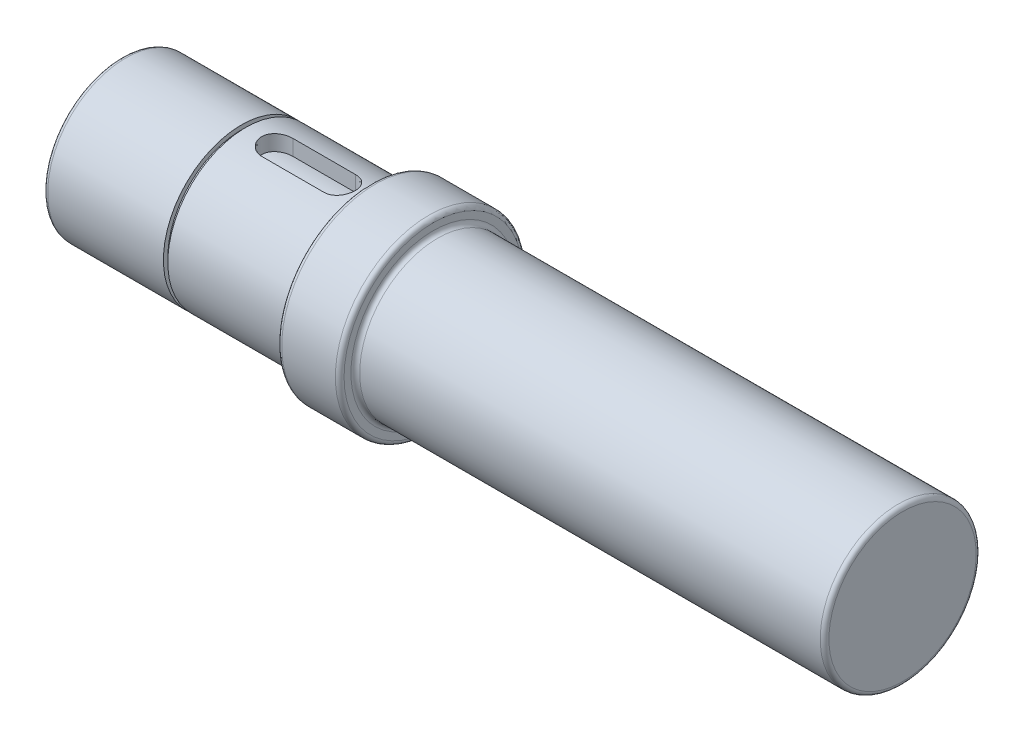
ISO-10303-21;
HEADER;
FILE_DESCRIPTION(('STEP AP214'),'2;1');
FILE_NAME('part.step','',(''),(''),'','','');
FILE_SCHEMA(('AUTOMOTIVE_DESIGN { 1 0 10303 214 1 1 1 1 }'));
ENDSEC;
DATA;
#1=APPLICATION_CONTEXT('core data for automotive mechanical design processes');
#2=APPLICATION_PROTOCOL_DEFINITION('international standard','automotive_design',2000,#1);
#3=PRODUCT_CONTEXT('',#1,'mechanical');
#4=PRODUCT('Part','Part','',(#3));
#5=PRODUCT_RELATED_PRODUCT_CATEGORY('part','',(#4));
#6=PRODUCT_DEFINITION_FORMATION('','',#4);
#7=PRODUCT_DEFINITION_CONTEXT('part definition',#1,'design');
#8=PRODUCT_DEFINITION('design','',#6,#7);
#9=PRODUCT_DEFINITION_SHAPE('','',#8);
#10=(LENGTH_UNIT() NAMED_UNIT(*) SI_UNIT(.MILLI.,.METRE.));
#11=(NAMED_UNIT(*) PLANE_ANGLE_UNIT() SI_UNIT($,.RADIAN.));
#12=(NAMED_UNIT(*) SI_UNIT($,.STERADIAN.) SOLID_ANGLE_UNIT());
#13=UNCERTAINTY_MEASURE_WITH_UNIT(LENGTH_MEASURE(1.E-05),#10,'distance_accuracy_value','');
#14=(GEOMETRIC_REPRESENTATION_CONTEXT(3) GLOBAL_UNCERTAINTY_ASSIGNED_CONTEXT((#13)) GLOBAL_UNIT_ASSIGNED_CONTEXT((#10,
#11,#12)) REPRESENTATION_CONTEXT('',''));
#15=CARTESIAN_POINT('',(0.,0.,0.));
#16=DIRECTION('',(0.,0.,1.));
#17=DIRECTION('',(1.,0.,0.));
#18=AXIS2_PLACEMENT_3D('',#15,#16,#17);
#19=CARTESIAN_POINT('',(318.008,0.,0.));
#20=DIRECTION('',(1.,0.,0.));
#21=DIRECTION('',(0.,0.,-1.));
#22=AXIS2_PLACEMENT_3D('',#19,#20,#21);
#23=CYLINDRICAL_SURFACE('',#22,31.75);
#24=CARTESIAN_POINT('',(50.673,0.,0.));
#25=DIRECTION('',(1.,0.,0.));
#26=DIRECTION('',(0.,0.,-1.));
#27=AXIS2_PLACEMENT_3D('',#24,#25,#26);
#28=CIRCLE('',#27,31.75);
#29=CARTESIAN_POINT('',(50.673,0.,-31.75));
#30=VERTEX_POINT('',#29);
#31=EDGE_CURVE('E188',#30,#30,#28,.T.);
#32=ORIENTED_EDGE('',*,*,#31,.T.);
#33=EDGE_LOOP('',(#32));
#34=FACE_BOUND('',#33,.T.);
#35=CARTESIAN_POINT('',(99.822,0.,0.));
#36=DIRECTION('',(1.,0.,0.));
#37=DIRECTION('',(0.,0.,-1.));
#38=AXIS2_PLACEMENT_3D('',#35,#36,#37);
#39=CIRCLE('',#38,31.75);
#40=CARTESIAN_POINT('',(99.822,0.,-31.75));
#41=VERTEX_POINT('',#40);
#42=EDGE_CURVE('E192',#41,#41,#39,.T.);
#43=ORIENTED_EDGE('',*,*,#42,.F.);
#44=EDGE_LOOP('',(#43));
#45=FACE_BOUND('',#44,.T.);
#46=CARTESIAN_POINT('',(88.9,31.1085197333464,6.35000000000002));
#47=CARTESIAN_POINT('',(89.7411838584888,31.1085197333463,6.35000000000002));
#48=CARTESIAN_POINT('',(90.5664285797414,31.143702637818,6.18365868766048));
#49=CARTESIAN_POINT('',(92.1031323767784,31.2636096253235,5.54567957546157));
#50=CARTESIAN_POINT('',(92.8061219084431,31.3474662779309,5.07414415278685));
#51=CARTESIAN_POINT('',(94.5582549968107,31.597773091446,3.32198124296136));
#52=CARTESIAN_POINT('',(95.2486500228985,31.749730004665,1.66607568080148));
#53=CARTESIAN_POINT('',(95.2513457951289,31.7502691589406,-1.65576927079387));
#54=CARTESIAN_POINT('',(94.5721209463598,31.599838788718,-3.30690169859765));
#55=CARTESIAN_POINT('',(92.2128218539865,31.2626237555181,-5.66866529599969));
#56=CARTESIAN_POINT('',(90.5823786748942,31.1085197333464,-6.34999999999999));
#57=CARTESIAN_POINT('',(88.9,31.1085197333464,-6.34999999999998));
#58=B_SPLINE_CURVE_WITH_KNOTS('',3,(#46,#47,#48,#49,#50,#51,#52,#53,#54,#55,#56,#57),
.UNSPECIFIED.,.F.,.F.,(4,2,2,2,2,4),(0.,0.125,0.25,0.5,0.75,1.),.UNSPECIFIED.);
#59=CARTESIAN_POINT('',(88.9,31.1085197333464,6.34999999999997));
#60=VERTEX_POINT('',#59);
#61=CARTESIAN_POINT('',(88.9,31.1085197333463,-6.35000000000008));
#62=VERTEX_POINT('',#61);
#63=EDGE_CURVE('E67',#60,#62,#58,.T.);
#64=ORIENTED_EDGE('',*,*,#63,.F.);
#65=DIRECTION('',(1.,0.,0.));
#66=VECTOR('',#65,1.);
#67=CARTESIAN_POINT('',(318.008,31.1085197333464,6.34999999999991));
#68=LINE('',#67,#66);
#69=CARTESIAN_POINT('',(63.5,31.1085197333464,6.34999999999998));
#70=VERTEX_POINT('',#69);
#71=EDGE_CURVE('E106',#70,#60,#68,.T.);
#72=ORIENTED_EDGE('',*,*,#71,.F.);
#73=CARTESIAN_POINT('',(63.5,31.1085197333464,-6.35));
#74=CARTESIAN_POINT('',(62.6588161415112,31.1085197333464,-6.35));
#75=CARTESIAN_POINT('',(61.8335714202586,31.143702637818,-6.18365868766046));
#76=CARTESIAN_POINT('',(60.2968676232216,31.2636096253235,-5.54567957546155));
#77=CARTESIAN_POINT('',(59.5938780915569,31.3474662779309,-5.07414415278683));
#78=CARTESIAN_POINT('',(57.8417450031893,31.597773091446,-3.32198124296134));
#79=CARTESIAN_POINT('',(57.1513499771015,31.749730004665,-1.66607568080146));
#80=CARTESIAN_POINT('',(57.1486542048711,31.7502691589406,1.65576927079387));
#81=CARTESIAN_POINT('',(57.8278790536402,31.599838788718,3.30690169859764));
#82=CARTESIAN_POINT('',(60.1871781460135,31.2626237555181,5.66866529599969));
#83=CARTESIAN_POINT('',(61.8176213251058,31.1085197333464,6.35));
#84=CARTESIAN_POINT('',(63.5,31.1085197333464,6.35));
#85=B_SPLINE_CURVE_WITH_KNOTS('',3,(#73,#74,#75,#76,#77,#78,#79,#80,#81,#82,#83,#84),
.UNSPECIFIED.,.F.,.F.,(4,2,2,2,2,4),(0.,0.125,0.25,0.5,0.75,1.),.UNSPECIFIED.);
#86=CARTESIAN_POINT('',(63.5,31.1085197333464,-6.35000000000004));
#87=VERTEX_POINT('',#86);
#88=EDGE_CURVE('E114',#87,#70,#85,.T.);
#89=ORIENTED_EDGE('',*,*,#88,.F.);
#90=DIRECTION('',(1.,0.,0.));
#91=VECTOR('',#90,1.);
#92=CARTESIAN_POINT('',(318.008,31.1085197333463,-6.35000000000009));
#93=LINE('',#92,#91);
#94=EDGE_CURVE('E172',#87,#62,#93,.T.);
#95=ORIENTED_EDGE('',*,*,#94,.T.);
#96=EDGE_LOOP('',(#64,#72,#89,#95));
#97=FACE_BOUND('',#96,.T.);
#98=ADVANCED_FACE('F47',(#34,#45,#97),#23,.T.);
#99=CARTESIAN_POINT('',(318.008,0.,0.));
#100=DIRECTION('',(-1.,0.,0.));
#101=DIRECTION('',(0.,0.,1.));
#102=AXIS2_PLACEMENT_3D('',#99,#100,#101);
#103=PLANE('',#102);
#104=CARTESIAN_POINT('',(318.008,0.,0.));
#105=DIRECTION('',(1.,0.,0.));
#106=DIRECTION('',(0.,0.,-1.));
#107=AXIS2_PLACEMENT_3D('',#104,#105,#106);
#108=CIRCLE('',#107,29.972);
#109=CARTESIAN_POINT('',(318.008,0.,-29.972));
#110=VERTEX_POINT('',#109);
#111=EDGE_CURVE('E11',#110,#110,#108,.T.);
#112=ORIENTED_EDGE('',*,*,#111,.T.);
#113=EDGE_LOOP('',(#112));
#114=FACE_BOUND('',#113,.T.);
#115=ADVANCED_FACE('F49',(#114),#103,.F.);
#116=CARTESIAN_POINT('',(316.23,0.,0.));
#117=DIRECTION('',(1.,0.,0.));
#118=DIRECTION('',(0.,0.,-1.));
#119=AXIS2_PLACEMENT_3D('',#116,#117,#118);
#120=TOROIDAL_SURFACE('',#119,29.972,1.778);
#121=CARTESIAN_POINT('',(316.23,0.,0.));
#122=DIRECTION('',(1.,0.,0.));
#123=DIRECTION('',(0.,0.,-1.));
#124=AXIS2_PLACEMENT_3D('',#121,#122,#123);
#125=CIRCLE('',#124,31.75);
#126=CARTESIAN_POINT('',(316.23,0.,-31.75));
#127=VERTEX_POINT('',#126);
#128=EDGE_CURVE('E59',#127,#127,#125,.T.);
#129=ORIENTED_EDGE('',*,*,#128,.T.);
#130=EDGE_LOOP('',(#129));
#131=FACE_BOUND('',#130,.T.);
#132=ORIENTED_EDGE('',*,*,#111,.F.);
#133=EDGE_LOOP('',(#132));
#134=FACE_BOUND('',#133,.T.);
#135=ADVANCED_FACE('F286',(#131,#134),#120,.T.);
#136=CARTESIAN_POINT('',(318.008,0.,0.));
#137=DIRECTION('',(1.,0.,0.));
#138=DIRECTION('',(0.,0.,-1.));
#139=AXIS2_PLACEMENT_3D('',#136,#137,#138);
#140=CYLINDRICAL_SURFACE('',#139,31.75);
#141=ORIENTED_EDGE('',*,*,#128,.F.);
#142=EDGE_LOOP('',(#141));
#143=FACE_BOUND('',#142,.T.);
#144=CARTESIAN_POINT('',(128.778,0.,0.));
#145=DIRECTION('',(1.,0.,0.));
#146=DIRECTION('',(0.,0.,-1.));
#147=AXIS2_PLACEMENT_3D('',#144,#145,#146);
#148=CIRCLE('',#147,31.75);
#149=CARTESIAN_POINT('',(128.778,0.,-31.75));
#150=VERTEX_POINT('',#149);
#151=EDGE_CURVE('E220',#150,#150,#148,.T.);
#152=ORIENTED_EDGE('',*,*,#151,.T.);
#153=EDGE_LOOP('',(#152));
#154=FACE_BOUND('',#153,.T.);
#155=ADVANCED_FACE('F283',(#143,#154),#140,.T.);
#156=CARTESIAN_POINT('',(128.778,0.,0.));
#157=DIRECTION('',(1.,0.,0.));
#158=DIRECTION('',(0.,0.,-1.));
#159=AXIS2_PLACEMENT_3D('',#156,#157,#158);
#160=TOROIDAL_SURFACE('',#159,33.528,1.778);
#161=ORIENTED_EDGE('',*,*,#151,.F.);
#162=EDGE_LOOP('',(#161));
#163=FACE_BOUND('',#162,.T.);
#164=CARTESIAN_POINT('',(127.,0.,0.));
#165=DIRECTION('',(1.,0.,0.));
#166=DIRECTION('',(0.,0.,-1.));
#167=AXIS2_PLACEMENT_3D('',#164,#165,#166);
#168=CIRCLE('',#167,33.528);
#169=CARTESIAN_POINT('',(127.,0.,-33.528));
#170=VERTEX_POINT('',#169);
#171=EDGE_CURVE('E216',#170,#170,#168,.T.);
#172=ORIENTED_EDGE('',*,*,#171,.T.);
#173=EDGE_LOOP('',(#172));
#174=FACE_BOUND('',#173,.T.);
#175=ADVANCED_FACE('F279',(#163,#174),#160,.F.);
#176=CARTESIAN_POINT('',(127.,0.,0.));
#177=DIRECTION('',(-1.,0.,0.));
#178=DIRECTION('',(0.,0.,1.));
#179=AXIS2_PLACEMENT_3D('',#176,#177,#178);
#180=PLANE('',#179);
#181=ORIENTED_EDGE('',*,*,#171,.F.);
#182=EDGE_LOOP('',(#181));
#183=FACE_BOUND('',#182,.T.);
#184=CARTESIAN_POINT('',(127.,0.,0.));
#185=DIRECTION('',(1.,0.,0.));
#186=DIRECTION('',(0.,0.,-1.));
#187=AXIS2_PLACEMENT_3D('',#184,#185,#186);
#188=CIRCLE('',#187,36.322);
#189=CARTESIAN_POINT('',(127.,0.,-36.322));
#190=VERTEX_POINT('',#189);
#191=EDGE_CURVE('E212',#190,#190,#188,.T.);
#192=ORIENTED_EDGE('',*,*,#191,.T.);
#193=EDGE_LOOP('',(#192));
#194=FACE_BOUND('',#193,.T.);
#195=ADVANCED_FACE('F275',(#183,#194),#180,.F.);
#196=CARTESIAN_POINT('',(125.222,0.,0.));
#197=DIRECTION('',(1.,0.,0.));
#198=DIRECTION('',(0.,0.,-1.));
#199=AXIS2_PLACEMENT_3D('',#196,#197,#198);
#200=TOROIDAL_SURFACE('',#199,36.322,1.778);
#201=CARTESIAN_POINT('',(125.222,0.,0.));
#202=DIRECTION('',(1.,0.,0.));
#203=DIRECTION('',(0.,0.,-1.));
#204=AXIS2_PLACEMENT_3D('',#201,#202,#203);
#205=CIRCLE('',#204,38.1);
#206=CARTESIAN_POINT('',(125.222,0.,-38.1));
#207=VERTEX_POINT('',#206);
#208=EDGE_CURVE('E208',#207,#207,#205,.T.);
#209=ORIENTED_EDGE('',*,*,#208,.T.);
#210=EDGE_LOOP('',(#209));
#211=FACE_BOUND('',#210,.T.);
#212=ORIENTED_EDGE('',*,*,#191,.F.);
#213=EDGE_LOOP('',(#212));
#214=FACE_BOUND('',#213,.T.);
#215=ADVANCED_FACE('F271',(#211,#214),#200,.T.);
#216=CARTESIAN_POINT('',(318.008,0.,0.));
#217=DIRECTION('',(1.,0.,0.));
#218=DIRECTION('',(0.,0.,-1.));
#219=AXIS2_PLACEMENT_3D('',#216,#217,#218);
#220=CYLINDRICAL_SURFACE('',#219,38.1);
#221=ORIENTED_EDGE('',*,*,#208,.F.);
#222=EDGE_LOOP('',(#221));
#223=FACE_BOUND('',#222,.T.);
#224=CARTESIAN_POINT('',(103.378,0.,0.));
#225=DIRECTION('',(1.,0.,0.));
#226=DIRECTION('',(0.,0.,-1.));
#227=AXIS2_PLACEMENT_3D('',#224,#225,#226);
#228=CIRCLE('',#227,38.1);
#229=CARTESIAN_POINT('',(103.378,0.,-38.1));
#230=VERTEX_POINT('',#229);
#231=EDGE_CURVE('E204',#230,#230,#228,.T.);
#232=ORIENTED_EDGE('',*,*,#231,.T.);
#233=EDGE_LOOP('',(#232));
#234=FACE_BOUND('',#233,.T.);
#235=ADVANCED_FACE('F267',(#223,#234),#220,.T.);
#236=CARTESIAN_POINT('',(103.378,0.,0.));
#237=DIRECTION('',(1.,0.,0.));
#238=DIRECTION('',(0.,0.,-1.));
#239=AXIS2_PLACEMENT_3D('',#236,#237,#238);
#240=TOROIDAL_SURFACE('',#239,36.322,1.778);
#241=CARTESIAN_POINT('',(101.6,0.,0.));
#242=DIRECTION('',(1.,0.,0.));
#243=DIRECTION('',(0.,0.,-1.));
#244=AXIS2_PLACEMENT_3D('',#241,#242,#243);
#245=CIRCLE('',#244,36.322);
#246=CARTESIAN_POINT('',(101.6,0.,-36.322));
#247=VERTEX_POINT('',#246);
#248=EDGE_CURVE('E200',#247,#247,#245,.T.);
#249=ORIENTED_EDGE('',*,*,#248,.T.);
#250=EDGE_LOOP('',(#249));
#251=FACE_BOUND('',#250,.T.);
#252=ORIENTED_EDGE('',*,*,#231,.F.);
#253=EDGE_LOOP('',(#252));
#254=FACE_BOUND('',#253,.T.);
#255=ADVANCED_FACE('F263',(#251,#254),#240,.T.);
#256=CARTESIAN_POINT('',(101.6,0.,0.));
#257=DIRECTION('',(1.,0.,0.));
#258=DIRECTION('',(0.,0.,-1.));
#259=AXIS2_PLACEMENT_3D('',#256,#257,#258);
#260=PLANE('',#259);
#261=ORIENTED_EDGE('',*,*,#248,.F.);
#262=EDGE_LOOP('',(#261));
#263=FACE_BOUND('',#262,.T.);
#264=CARTESIAN_POINT('',(101.6,0.,0.));
#265=DIRECTION('',(1.,0.,0.));
#266=DIRECTION('',(0.,0.,-1.));
#267=AXIS2_PLACEMENT_3D('',#264,#265,#266);
#268=CIRCLE('',#267,33.528);
#269=CARTESIAN_POINT('',(101.6,0.,-33.528));
#270=VERTEX_POINT('',#269);
#271=EDGE_CURVE('E196',#270,#270,#268,.T.);
#272=ORIENTED_EDGE('',*,*,#271,.T.);
#273=EDGE_LOOP('',(#272));
#274=FACE_BOUND('',#273,.T.);
#275=ADVANCED_FACE('F259',(#263,#274),#260,.F.);
#276=CARTESIAN_POINT('',(99.822,0.,0.));
#277=DIRECTION('',(1.,0.,0.));
#278=DIRECTION('',(0.,0.,-1.));
#279=AXIS2_PLACEMENT_3D('',#276,#277,#278);
#280=TOROIDAL_SURFACE('',#279,33.528,1.778);
#281=ORIENTED_EDGE('',*,*,#271,.F.);
#282=EDGE_LOOP('',(#281));
#283=FACE_BOUND('',#282,.T.);
#284=ORIENTED_EDGE('',*,*,#42,.T.);
#285=EDGE_LOOP('',(#284));
#286=FACE_BOUND('',#285,.T.);
#287=ADVANCED_FACE('F255',(#283,#286),#280,.F.);
#288=CARTESIAN_POINT('',(50.673,0.,0.));
#289=DIRECTION('',(-1.,0.,0.));
#290=DIRECTION('',(0.,0.,1.));
#291=AXIS2_PLACEMENT_3D('',#288,#289,#290);
#292=PLANE('',#291);
#293=CARTESIAN_POINT('',(50.673,0.,0.));
#294=DIRECTION('',(1.,0.,0.));
#295=DIRECTION('',(0.,0.,-1.));
#296=AXIS2_PLACEMENT_3D('',#293,#294,#295);
#297=CIRCLE('',#296,29.972);
#298=CARTESIAN_POINT('',(50.673,0.,-29.972));
#299=VERTEX_POINT('',#298);
#300=EDGE_CURVE('E184',#299,#299,#297,.T.);
#301=ORIENTED_EDGE('',*,*,#300,.T.);
#302=EDGE_LOOP('',(#301));
#303=FACE_BOUND('',#302,.T.);
#304=ORIENTED_EDGE('',*,*,#31,.F.);
#305=EDGE_LOOP('',(#304));
#306=FACE_BOUND('',#305,.T.);
#307=ADVANCED_FACE('F251',(#303,#306),#292,.T.);
#308=CARTESIAN_POINT('',(318.008,0.,0.));
#309=DIRECTION('',(1.,0.,0.));
#310=DIRECTION('',(0.,0.,-1.));
#311=AXIS2_PLACEMENT_3D('',#308,#309,#310);
#312=CYLINDRICAL_SURFACE('',#311,29.972);
#313=CARTESIAN_POINT('',(48.895,0.,0.));
#314=DIRECTION('',(1.,0.,0.));
#315=DIRECTION('',(0.,0.,-1.));
#316=AXIS2_PLACEMENT_3D('',#313,#314,#315);
#317=CIRCLE('',#316,29.972);
#318=CARTESIAN_POINT('',(48.895,0.,-29.972));
#319=VERTEX_POINT('',#318);
#320=EDGE_CURVE('E180',#319,#319,#317,.T.);
#321=ORIENTED_EDGE('',*,*,#320,.T.);
#322=EDGE_LOOP('',(#321));
#323=FACE_BOUND('',#322,.T.);
#324=ORIENTED_EDGE('',*,*,#300,.F.);
#325=EDGE_LOOP('',(#324));
#326=FACE_BOUND('',#325,.T.);
#327=ADVANCED_FACE('F247',(#323,#326),#312,.T.);
#328=CARTESIAN_POINT('',(48.895,0.,1.90819582357445E-13));
#329=DIRECTION('',(-1.,0.,0.));
#330=DIRECTION('',(0.,0.,1.));
#331=AXIS2_PLACEMENT_3D('',#328,#329,#330);
#332=PLANE('',#331);
#333=ORIENTED_EDGE('',*,*,#320,.F.);
#334=EDGE_LOOP('',(#333));
#335=FACE_BOUND('',#334,.T.);
#336=CARTESIAN_POINT('',(48.895,0.,0.));
#337=DIRECTION('',(1.,0.,0.));
#338=DIRECTION('',(0.,0.,-1.));
#339=AXIS2_PLACEMENT_3D('',#336,#337,#338);
#340=CIRCLE('',#339,31.75);
#341=CARTESIAN_POINT('',(48.895,0.,-31.75));
#342=VERTEX_POINT('',#341);
#343=EDGE_CURVE('E176',#342,#342,#340,.T.);
#344=ORIENTED_EDGE('',*,*,#343,.T.);
#345=EDGE_LOOP('',(#344));
#346=FACE_BOUND('',#345,.T.);
#347=ADVANCED_FACE('F242',(#335,#346),#332,.F.);
#348=ORIENTED_EDGE('',*,*,#343,.F.);
#349=EDGE_LOOP('',(#348));
#350=FACE_BOUND('',#349,.T.);
#351=CARTESIAN_POINT('',(1.778,0.,0.));
#352=DIRECTION('',(1.,0.,0.));
#353=DIRECTION('',(0.,0.,-1.));
#354=AXIS2_PLACEMENT_3D('',#351,#352,#353);
#355=CIRCLE('',#354,31.75);
#356=CARTESIAN_POINT('',(1.778,0.,-31.75));
#357=VERTEX_POINT('',#356);
#358=EDGE_CURVE('E171',#357,#357,#355,.T.);
#359=ORIENTED_EDGE('',*,*,#358,.T.);
#360=EDGE_LOOP('',(#359));
#361=FACE_BOUND('',#360,.T.);
#362=ADVANCED_FACE('F232',(#350,#361),#23,.T.);
#363=CARTESIAN_POINT('',(1.778,0.,0.));
#364=DIRECTION('',(1.,0.,0.));
#365=DIRECTION('',(0.,0.,-1.));
#366=AXIS2_PLACEMENT_3D('',#363,#364,#365);
#367=TOROIDAL_SURFACE('',#366,29.972,1.778);
#368=ORIENTED_EDGE('',*,*,#358,.F.);
#369=EDGE_LOOP('',(#368));
#370=FACE_BOUND('',#369,.T.);
#371=CARTESIAN_POINT('',(0.,0.,0.));
#372=DIRECTION('',(1.,0.,0.));
#373=DIRECTION('',(0.,0.,-1.));
#374=AXIS2_PLACEMENT_3D('',#371,#372,#373);
#375=CIRCLE('',#374,29.972);
#376=CARTESIAN_POINT('',(0.,0.,-29.972));
#377=VERTEX_POINT('',#376);
#378=EDGE_CURVE('E167',#377,#377,#375,.T.);
#379=ORIENTED_EDGE('',*,*,#378,.T.);
#380=EDGE_LOOP('',(#379));
#381=FACE_BOUND('',#380,.T.);
#382=ADVANCED_FACE('F241',(#370,#381),#367,.T.);
#383=CARTESIAN_POINT('',(0.,0.,0.));
#384=DIRECTION('',(1.,0.,0.));
#385=DIRECTION('',(0.,0.,-1.));
#386=AXIS2_PLACEMENT_3D('',#383,#384,#385);
#387=PLANE('',#386);
#388=ORIENTED_EDGE('',*,*,#378,.F.);
#389=EDGE_LOOP('',(#388));
#390=FACE_BOUND('',#389,.T.);
#391=ADVANCED_FACE('F143',(#390),#387,.F.);
#392=CARTESIAN_POINT('',(318.008,-6.35,0.));
#393=DIRECTION('',(1.,0.,0.));
#394=DIRECTION('',(0.,0.,-1.));
#395=AXIS2_PLACEMENT_3D('',#392,#393,#394);
#396=CYLINDRICAL_SURFACE('',#395,31.75);
#397=DIRECTION('',(1.,0.,0.));
#398=VECTOR('',#397,1.);
#399=CARTESIAN_POINT('',(318.008,24.7585197333463,-6.35000000000009));
#400=LINE('',#399,#398);
#401=CARTESIAN_POINT('',(63.5,24.7585197333464,-6.35000000000004));
#402=VERTEX_POINT('',#401);
#403=CARTESIAN_POINT('',(88.9,24.7585197333464,-6.35000000000003));
#404=VERTEX_POINT('',#403);
#405=EDGE_CURVE('E100',#402,#404,#400,.T.);
#406=ORIENTED_EDGE('',*,*,#405,.F.);
#407=CARTESIAN_POINT('',(63.5,24.7585197333464,6.35));
#408=CARTESIAN_POINT('',(61.8176213251058,24.7585197333464,6.35));
#409=CARTESIAN_POINT('',(60.1871781460135,24.9126237555181,5.66866529599969));
#410=CARTESIAN_POINT('',(57.8278790536402,25.249838788718,3.30690169859764));
#411=CARTESIAN_POINT('',(57.1486542048711,25.4002691589406,1.65576927079387));
#412=CARTESIAN_POINT('',(57.1513499771015,25.399730004665,-1.66607568080146));
#413=CARTESIAN_POINT('',(57.8417450031893,25.2477730914459,-3.32198124296134));
#414=CARTESIAN_POINT('',(59.5938780915569,24.9974662779309,-5.07414415278683));
#415=CARTESIAN_POINT('',(60.2968676232216,24.9136096253235,-5.54567957546155));
#416=CARTESIAN_POINT('',(61.8335714202586,24.793702637818,-6.18365868766046));
#417=CARTESIAN_POINT('',(62.6588161415112,24.7585197333464,-6.35));
#418=CARTESIAN_POINT('',(63.5,24.7585197333464,-6.35));
#419=B_SPLINE_CURVE_WITH_KNOTS('',3,(#407,#408,#409,#410,#411,#412,#413,#414,#415,#416,#417,
#418),.UNSPECIFIED.,.F.,.F.,(4,2,2,2,2,4),(0.,0.25,0.5,0.75,0.875,1.),.UNSPECIFIED.);
#420=CARTESIAN_POINT('',(63.5,24.7585197333464,6.34999999999998));
#421=VERTEX_POINT('',#420);
#422=EDGE_CURVE('E95',#402,#421,#419,.F.);
#423=ORIENTED_EDGE('',*,*,#422,.T.);
#424=DIRECTION('',(1.,0.,0.));
#425=VECTOR('',#424,1.);
#426=CARTESIAN_POINT('',(318.008,24.7585197333464,6.34999999999991));
#427=LINE('',#426,#425);
#428=CARTESIAN_POINT('',(88.9,24.7585197333464,6.34999999999997));
#429=VERTEX_POINT('',#428);
#430=EDGE_CURVE('E90',#421,#429,#427,.T.);
#431=ORIENTED_EDGE('',*,*,#430,.T.);
#432=CARTESIAN_POINT('',(88.9,24.7585197333464,-6.34999999999998));
#433=CARTESIAN_POINT('',(90.5823786748942,24.7585197333464,-6.34999999999999));
#434=CARTESIAN_POINT('',(92.2128218539865,24.9126237555181,-5.66866529599969));
#435=CARTESIAN_POINT('',(94.5721209463598,25.249838788718,-3.30690169859765));
#436=CARTESIAN_POINT('',(95.2513457951289,25.4002691589406,-1.65576927079387));
#437=CARTESIAN_POINT('',(95.2486500228985,25.399730004665,1.66607568080148));
#438=CARTESIAN_POINT('',(94.5582549968107,25.247773091446,3.32198124296136));
#439=CARTESIAN_POINT('',(92.8061219084431,24.9974662779309,5.07414415278685));
#440=CARTESIAN_POINT('',(92.1031323767784,24.9136096253235,5.54567957546157));
#441=CARTESIAN_POINT('',(90.5664285797414,24.793702637818,6.18365868766048));
#442=CARTESIAN_POINT('',(89.7411838584888,24.7585197333464,6.35000000000002));
#443=CARTESIAN_POINT('',(88.9,24.7585197333464,6.35000000000002));
#444=B_SPLINE_CURVE_WITH_KNOTS('',3,(#432,#433,#434,#435,#436,#437,#438,#439,#440,#441,#442,
#443),.UNSPECIFIED.,.F.,.F.,(4,2,2,2,2,4),(0.,0.25,0.5,0.75,0.875,1.),.UNSPECIFIED.);
#445=EDGE_CURVE('E162',#429,#404,#444,.F.);
#446=ORIENTED_EDGE('',*,*,#445,.T.);
#447=EDGE_LOOP('',(#406,#423,#431,#446));
#448=FACE_BOUND('',#447,.T.);
#449=ADVANCED_FACE('F98',(#448),#396,.T.);
#450=CARTESIAN_POINT('',(88.9,31.1085197333464,6.35000000000002));
#451=CARTESIAN_POINT('',(89.7411838584888,31.1085197333463,6.35000000000002));
#452=CARTESIAN_POINT('',(90.5664285797414,31.143702637818,6.18365868766048));
#453=CARTESIAN_POINT('',(92.1031323767784,31.2636096253235,5.54567957546157));
#454=CARTESIAN_POINT('',(92.8061219084431,31.3474662779309,5.07414415278685));
#455=CARTESIAN_POINT('',(94.5582549968107,31.597773091446,3.32198124296136));
#456=CARTESIAN_POINT('',(95.2486500228985,31.749730004665,1.66607568080148));
#457=CARTESIAN_POINT('',(95.2513457951289,31.7502691589406,-1.65576927079387));
#458=CARTESIAN_POINT('',(94.5721209463598,31.599838788718,-3.30690169859765));
#459=CARTESIAN_POINT('',(92.2128218539865,31.2626237555181,-5.66866529599969));
#460=CARTESIAN_POINT('',(90.5823786748942,31.1085197333464,-6.34999999999999));
#461=CARTESIAN_POINT('',(88.9,31.1085197333464,-6.34999999999998));
#462=B_SPLINE_CURVE_WITH_KNOTS('',3,(#450,#451,#452,#453,#454,#455,#456,#457,#458,#459,#460,
#461),.UNSPECIFIED.,.F.,.F.,(4,2,2,2,2,4),(0.,0.125,0.25,0.5,0.75,1.),.UNSPECIFIED.);
#463=DIRECTION('',(0.,-1.,0.));
#464=VECTOR('',#463,1.);
#465=SURFACE_OF_LINEAR_EXTRUSION('',#462,#464);
#466=ORIENTED_EDGE('',*,*,#445,.F.);
#467=DIRECTION('',(0.,-1.,0.));
#468=VECTOR('',#467,1.);
#469=CARTESIAN_POINT('',(88.9,31.1085197333464,6.34999999999992));
#470=LINE('',#469,#468);
#471=EDGE_CURVE('E74',#60,#429,#470,.T.);
#472=ORIENTED_EDGE('',*,*,#471,.F.);
#473=ORIENTED_EDGE('',*,*,#63,.T.);
#474=DIRECTION('',(0.,-1.,0.));
#475=VECTOR('',#474,1.);
#476=CARTESIAN_POINT('',(88.9,31.1085197333463,-6.35000000000008));
#477=LINE('',#476,#475);
#478=EDGE_CURVE('E122',#62,#404,#477,.T.);
#479=ORIENTED_EDGE('',*,*,#478,.T.);
#480=EDGE_LOOP('',(#466,#472,#473,#479));
#481=FACE_BOUND('',#480,.T.);
#482=ADVANCED_FACE('F142',(#481),#465,.T.);
#483=CARTESIAN_POINT('',(318.008,31.1085197333464,6.34999999999991));
#484=DIRECTION('',(0.,0.,-1.));
#485=DIRECTION('',(-1.,0.,0.));
#486=AXIS2_PLACEMENT_3D('',#483,#484,#485);
#487=PLANE('',#486);
#488=ORIENTED_EDGE('',*,*,#430,.F.);
#489=DIRECTION('',(0.,-1.,0.));
#490=VECTOR('',#489,1.);
#491=CARTESIAN_POINT('',(63.5,31.1085197333464,6.35));
#492=LINE('',#491,#490);
#493=EDGE_CURVE('E111',#70,#421,#492,.T.);
#494=ORIENTED_EDGE('',*,*,#493,.F.);
#495=ORIENTED_EDGE('',*,*,#71,.T.);
#496=ORIENTED_EDGE('',*,*,#471,.T.);
#497=EDGE_LOOP('',(#488,#494,#495,#496));
#498=FACE_BOUND('',#497,.T.);
#499=ADVANCED_FACE('F120',(#498),#487,.T.);
#500=CARTESIAN_POINT('',(63.5,31.1085197333464,-6.35));
#501=CARTESIAN_POINT('',(62.6588161415112,31.1085197333464,-6.35));
#502=CARTESIAN_POINT('',(61.8335714202586,31.143702637818,-6.18365868766046));
#503=CARTESIAN_POINT('',(60.2968676232216,31.2636096253235,-5.54567957546155));
#504=CARTESIAN_POINT('',(59.5938780915569,31.3474662779309,-5.07414415278683));
#505=CARTESIAN_POINT('',(57.8417450031893,31.597773091446,-3.32198124296134));
#506=CARTESIAN_POINT('',(57.1513499771015,31.749730004665,-1.66607568080146));
#507=CARTESIAN_POINT('',(57.1486542048711,31.7502691589406,1.65576927079387));
#508=CARTESIAN_POINT('',(57.8278790536402,31.599838788718,3.30690169859764));
#509=CARTESIAN_POINT('',(60.1871781460135,31.2626237555181,5.66866529599969));
#510=CARTESIAN_POINT('',(61.8176213251058,31.1085197333464,6.35));
#511=CARTESIAN_POINT('',(63.5,31.1085197333464,6.35));
#512=B_SPLINE_CURVE_WITH_KNOTS('',3,(#500,#501,#502,#503,#504,#505,#506,#507,#508,#509,#510,
#511),.UNSPECIFIED.,.F.,.F.,(4,2,2,2,2,4),(0.,0.125,0.25,0.5,0.75,1.),.UNSPECIFIED.);
#513=DIRECTION('',(0.,-1.,0.));
#514=VECTOR('',#513,1.);
#515=SURFACE_OF_LINEAR_EXTRUSION('',#512,#514);
#516=ORIENTED_EDGE('',*,*,#422,.F.);
#517=DIRECTION('',(0.,-1.,0.));
#518=VECTOR('',#517,1.);
#519=CARTESIAN_POINT('',(63.4999999999999,31.1085197333463,-6.35000000000008));
#520=LINE('',#519,#518);
#521=EDGE_CURVE('E105',#87,#402,#520,.T.);
#522=ORIENTED_EDGE('',*,*,#521,.F.);
#523=ORIENTED_EDGE('',*,*,#88,.T.);
#524=ORIENTED_EDGE('',*,*,#493,.T.);
#525=EDGE_LOOP('',(#516,#522,#523,#524));
#526=FACE_BOUND('',#525,.T.);
#527=ADVANCED_FACE('F112',(#526),#515,.T.);
#528=CARTESIAN_POINT('',(318.008,31.1085197333463,-6.35000000000009));
#529=DIRECTION('',(0.,0.,-1.));
#530=DIRECTION('',(-1.,0.,0.));
#531=AXIS2_PLACEMENT_3D('',#528,#529,#530);
#532=PLANE('',#531);
#533=ORIENTED_EDGE('',*,*,#405,.T.);
#534=ORIENTED_EDGE('',*,*,#478,.F.);
#535=ORIENTED_EDGE('',*,*,#94,.F.);
#536=ORIENTED_EDGE('',*,*,#521,.T.);
#537=EDGE_LOOP('',(#533,#534,#535,#536));
#538=FACE_BOUND('',#537,.T.);
#539=ADVANCED_FACE('F144',(#538),#532,.F.);
#540=CLOSED_SHELL('',(#98,#115,#135,#155,#175,#195,#215,#235,#255,#275,#287,#307,#327,#347,#362,
#382,#391,#449,#482,#499,#527,#539));
#541=MANIFOLD_SOLID_BREP('B2',#540);
#542=ADVANCED_BREP_SHAPE_REPRESENTATION('',(#18,#541),#14);
#543=SHAPE_DEFINITION_REPRESENTATION(#9,#542);
ENDSEC;
END-ISO-10303-21;
